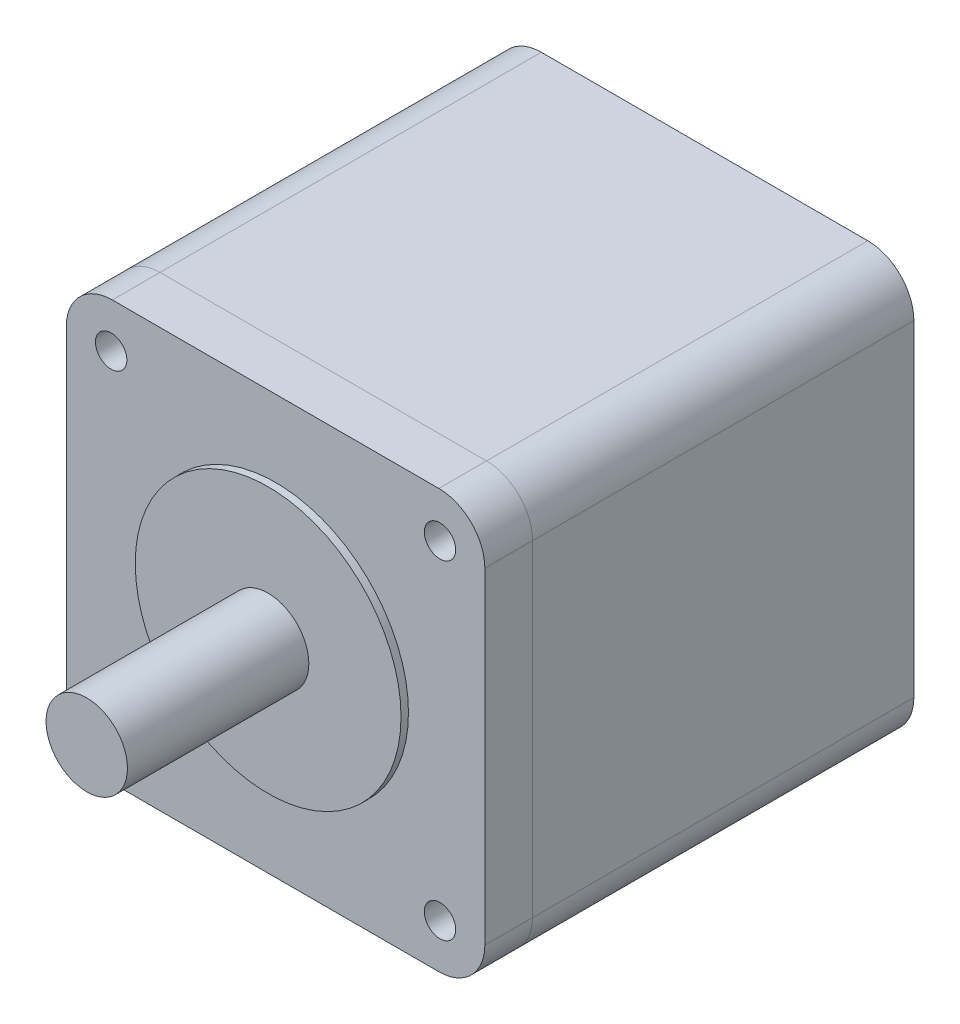
ISO-10303-21;
HEADER;
FILE_DESCRIPTION(('STEP AP214'),'2;1');
FILE_NAME('part.step','',(''),(''),'','','');
FILE_SCHEMA(('AUTOMOTIVE_DESIGN { 1 0 10303 214 1 1 1 1 }'));
ENDSEC;
DATA;
#1=APPLICATION_CONTEXT('core data for automotive mechanical design processes');
#2=APPLICATION_PROTOCOL_DEFINITION('international standard','automotive_design',2000,#1);
#3=PRODUCT_CONTEXT('',#1,'mechanical');
#4=PRODUCT('Part','Part','',(#3));
#5=PRODUCT_RELATED_PRODUCT_CATEGORY('part','',(#4));
#6=PRODUCT_DEFINITION_FORMATION('','',#4);
#7=PRODUCT_DEFINITION_CONTEXT('part definition',#1,'design');
#8=PRODUCT_DEFINITION('design','',#6,#7);
#9=PRODUCT_DEFINITION_SHAPE('','',#8);
#10=(LENGTH_UNIT() NAMED_UNIT(*) SI_UNIT(.MILLI.,.METRE.));
#11=(NAMED_UNIT(*) PLANE_ANGLE_UNIT() SI_UNIT($,.RADIAN.));
#12=(NAMED_UNIT(*) SI_UNIT($,.STERADIAN.) SOLID_ANGLE_UNIT());
#13=UNCERTAINTY_MEASURE_WITH_UNIT(LENGTH_MEASURE(1.E-05),#10,'distance_accuracy_value','');
#14=(GEOMETRIC_REPRESENTATION_CONTEXT(3) GLOBAL_UNCERTAINTY_ASSIGNED_CONTEXT((#13)) GLOBAL_UNIT_ASSIGNED_CONTEXT((#10,
#11,#12)) REPRESENTATION_CONTEXT('',''));
#15=CARTESIAN_POINT('',(0.,0.,0.));
#16=DIRECTION('',(0.,0.,1.));
#17=DIRECTION('',(1.,0.,0.));
#18=AXIS2_PLACEMENT_3D('',#15,#16,#17);
#19=CARTESIAN_POINT('',(70.2060040014881,-70.2060040014881,-164.));
#20=DIRECTION('',(0.,0.,1.));
#21=DIRECTION('',(1.,0.,0.));
#22=AXIS2_PLACEMENT_3D('',#19,#20,#21);
#23=CYLINDRICAL_SURFACE('',#22,19.7939959985119);
#24=CARTESIAN_POINT('',(70.2060040014881,-70.2060040014881,0.));
#25=DIRECTION('',(0.,0.,-1.));
#26=DIRECTION('',(1.,0.,0.));
#27=AXIS2_PLACEMENT_3D('',#24,#25,#26);
#28=CIRCLE('',#27,19.7939959985119);
#29=CARTESIAN_POINT('',(90.,-70.206004001488,0.));
#30=VERTEX_POINT('',#29);
#31=CARTESIAN_POINT('',(70.206004001488,-90.,0.));
#32=VERTEX_POINT('',#31);
#33=EDGE_CURVE('E154',#30,#32,#28,.T.);
#34=ORIENTED_EDGE('',*,*,#33,.T.);
#35=DIRECTION('',(0.,0.,1.));
#36=VECTOR('',#35,1.);
#37=CARTESIAN_POINT('',(70.206004001488,-90.,-164.));
#38=LINE('',#37,#36);
#39=CARTESIAN_POINT('',(70.206004001488,-90.,-164.));
#40=VERTEX_POINT('',#39);
#41=EDGE_CURVE('E12',#40,#32,#38,.T.);
#42=ORIENTED_EDGE('',*,*,#41,.F.);
#43=CARTESIAN_POINT('',(70.2060040014881,-70.2060040014881,-164.));
#44=DIRECTION('',(0.,0.,-1.));
#45=DIRECTION('',(1.,0.,0.));
#46=AXIS2_PLACEMENT_3D('',#43,#44,#45);
#47=CIRCLE('',#46,19.7939959985119);
#48=CARTESIAN_POINT('',(90.,-70.206004001488,-164.));
#49=VERTEX_POINT('',#48);
#50=EDGE_CURVE('E176',#49,#40,#47,.T.);
#51=ORIENTED_EDGE('',*,*,#50,.F.);
#52=DIRECTION('',(0.,0.,1.));
#53=VECTOR('',#52,1.);
#54=CARTESIAN_POINT('',(90.,-70.206004001488,-164.));
#55=LINE('',#54,#53);
#56=EDGE_CURVE('E150',#49,#30,#55,.T.);
#57=ORIENTED_EDGE('',*,*,#56,.T.);
#58=EDGE_LOOP('',(#34,#42,#51,#57));
#59=FACE_BOUND('',#58,.T.);
#60=ADVANCED_FACE('F53',(#59),#23,.T.);
#61=CARTESIAN_POINT('',(70.206004001488,-90.,-164.));
#62=DIRECTION('',(0.,1.,0.));
#63=DIRECTION('',(0.,0.,1.));
#64=AXIS2_PLACEMENT_3D('',#61,#62,#63);
#65=PLANE('',#64);
#66=DIRECTION('',(-1.,0.,0.));
#67=VECTOR('',#66,1.);
#68=CARTESIAN_POINT('',(70.206004001488,-90.,0.));
#69=LINE('',#68,#67);
#70=CARTESIAN_POINT('',(-70.206004001488,-90.,0.));
#71=VERTEX_POINT('',#70);
#72=EDGE_CURVE('E158',#32,#71,#69,.T.);
#73=ORIENTED_EDGE('',*,*,#72,.T.);
#74=DIRECTION('',(0.,0.,1.));
#75=VECTOR('',#74,1.);
#76=CARTESIAN_POINT('',(-70.206004001488,-90.,-164.));
#77=LINE('',#76,#75);
#78=CARTESIAN_POINT('',(-70.206004001488,-90.,-164.));
#79=VERTEX_POINT('',#78);
#80=EDGE_CURVE('E62',#79,#71,#77,.T.);
#81=ORIENTED_EDGE('',*,*,#80,.F.);
#82=DIRECTION('',(-1.,0.,0.));
#83=VECTOR('',#82,1.);
#84=CARTESIAN_POINT('',(70.206004001488,-90.,-164.));
#85=LINE('',#84,#83);
#86=EDGE_CURVE('E113',#40,#79,#85,.T.);
#87=ORIENTED_EDGE('',*,*,#86,.F.);
#88=ORIENTED_EDGE('',*,*,#41,.T.);
#89=EDGE_LOOP('',(#73,#81,#87,#88));
#90=FACE_BOUND('',#89,.T.);
#91=ADVANCED_FACE('F222',(#90),#65,.F.);
#92=CARTESIAN_POINT('',(-70.2060040014881,-70.2060040014881,-164.));
#93=DIRECTION('',(0.,0.,1.));
#94=DIRECTION('',(1.,0.,0.));
#95=AXIS2_PLACEMENT_3D('',#92,#93,#94);
#96=CYLINDRICAL_SURFACE('',#95,19.7939959985119);
#97=CARTESIAN_POINT('',(-70.2060040014881,-70.2060040014881,0.));
#98=DIRECTION('',(0.,0.,-1.));
#99=DIRECTION('',(-1.,0.,0.));
#100=AXIS2_PLACEMENT_3D('',#97,#98,#99);
#101=CIRCLE('',#100,19.7939959985119);
#102=CARTESIAN_POINT('',(-90.,-70.2060040014881,0.));
#103=VERTEX_POINT('',#102);
#104=EDGE_CURVE('E161',#71,#103,#101,.T.);
#105=ORIENTED_EDGE('',*,*,#104,.T.);
#106=DIRECTION('',(0.,0.,1.));
#107=VECTOR('',#106,1.);
#108=CARTESIAN_POINT('',(-90.,-70.2060040014881,-164.));
#109=LINE('',#108,#107);
#110=CARTESIAN_POINT('',(-90.,-70.2060040014881,-164.));
#111=VERTEX_POINT('',#110);
#112=EDGE_CURVE('E187',#111,#103,#109,.T.);
#113=ORIENTED_EDGE('',*,*,#112,.F.);
#114=CARTESIAN_POINT('',(-70.2060040014881,-70.2060040014881,-164.));
#115=DIRECTION('',(0.,0.,-1.));
#116=DIRECTION('',(-1.,0.,0.));
#117=AXIS2_PLACEMENT_3D('',#114,#115,#116);
#118=CIRCLE('',#117,19.7939959985119);
#119=EDGE_CURVE('E197',#79,#111,#118,.T.);
#120=ORIENTED_EDGE('',*,*,#119,.F.);
#121=ORIENTED_EDGE('',*,*,#80,.T.);
#122=EDGE_LOOP('',(#105,#113,#120,#121));
#123=FACE_BOUND('',#122,.T.);
#124=ADVANCED_FACE('F195',(#123),#96,.T.);
#125=CARTESIAN_POINT('',(-90.,-70.206004001488,-164.));
#126=DIRECTION('',(1.,0.,0.));
#127=DIRECTION('',(0.,0.,-1.));
#128=AXIS2_PLACEMENT_3D('',#125,#126,#127);
#129=PLANE('',#128);
#130=DIRECTION('',(0.,1.,0.));
#131=VECTOR('',#130,1.);
#132=CARTESIAN_POINT('',(-90.,-70.206004001488,0.));
#133=LINE('',#132,#131);
#134=CARTESIAN_POINT('',(-90.,70.206004001488,0.));
#135=VERTEX_POINT('',#134);
#136=EDGE_CURVE('E164',#103,#135,#133,.T.);
#137=ORIENTED_EDGE('',*,*,#136,.T.);
#138=DIRECTION('',(0.,0.,1.));
#139=VECTOR('',#138,1.);
#140=CARTESIAN_POINT('',(-90.,70.206004001488,-164.));
#141=LINE('',#140,#139);
#142=CARTESIAN_POINT('',(-90.,70.206004001488,-164.));
#143=VERTEX_POINT('',#142);
#144=EDGE_CURVE('E183',#143,#135,#141,.T.);
#145=ORIENTED_EDGE('',*,*,#144,.F.);
#146=DIRECTION('',(0.,1.,0.));
#147=VECTOR('',#146,1.);
#148=CARTESIAN_POINT('',(-90.,-70.206004001488,-164.));
#149=LINE('',#148,#147);
#150=EDGE_CURVE('E210',#111,#143,#149,.T.);
#151=ORIENTED_EDGE('',*,*,#150,.F.);
#152=ORIENTED_EDGE('',*,*,#112,.T.);
#153=EDGE_LOOP('',(#137,#145,#151,#152));
#154=FACE_BOUND('',#153,.T.);
#155=ADVANCED_FACE('F205',(#154),#129,.F.);
#156=CARTESIAN_POINT('',(-70.2060040014881,70.2060040014881,-164.));
#157=DIRECTION('',(0.,0.,1.));
#158=DIRECTION('',(1.,0.,0.));
#159=AXIS2_PLACEMENT_3D('',#156,#157,#158);
#160=CYLINDRICAL_SURFACE('',#159,19.7939959985119);
#161=CARTESIAN_POINT('',(-70.2060040014881,70.2060040014881,0.));
#162=DIRECTION('',(0.,0.,-1.));
#163=DIRECTION('',(-1.,0.,0.));
#164=AXIS2_PLACEMENT_3D('',#161,#162,#163);
#165=CIRCLE('',#164,19.7939959985119);
#166=CARTESIAN_POINT('',(-70.206004001488,90.,0.));
#167=VERTEX_POINT('',#166);
#168=EDGE_CURVE('E167',#135,#167,#165,.T.);
#169=ORIENTED_EDGE('',*,*,#168,.T.);
#170=DIRECTION('',(0.,0.,1.));
#171=VECTOR('',#170,1.);
#172=CARTESIAN_POINT('',(-70.206004001488,90.,-164.));
#173=LINE('',#172,#171);
#174=CARTESIAN_POINT('',(-70.206004001488,90.,-164.));
#175=VERTEX_POINT('',#174);
#176=EDGE_CURVE('E143',#175,#167,#173,.T.);
#177=ORIENTED_EDGE('',*,*,#176,.F.);
#178=CARTESIAN_POINT('',(-70.2060040014881,70.2060040014881,-164.));
#179=DIRECTION('',(0.,0.,-1.));
#180=DIRECTION('',(-1.,0.,0.));
#181=AXIS2_PLACEMENT_3D('',#178,#179,#180);
#182=CIRCLE('',#181,19.7939959985119);
#183=EDGE_CURVE('E132',#143,#175,#182,.T.);
#184=ORIENTED_EDGE('',*,*,#183,.F.);
#185=ORIENTED_EDGE('',*,*,#144,.T.);
#186=EDGE_LOOP('',(#169,#177,#184,#185));
#187=FACE_BOUND('',#186,.T.);
#188=ADVANCED_FACE('F208',(#187),#160,.T.);
#189=CARTESIAN_POINT('',(70.206004001488,90.,-164.));
#190=DIRECTION('',(0.,-1.,0.));
#191=DIRECTION('',(0.,0.,-1.));
#192=AXIS2_PLACEMENT_3D('',#189,#190,#191);
#193=PLANE('',#192);
#194=DIRECTION('',(1.,0.,0.));
#195=VECTOR('',#194,1.);
#196=CARTESIAN_POINT('',(70.206004001488,90.,0.));
#197=LINE('',#196,#195);
#198=CARTESIAN_POINT('',(70.206004001488,90.,0.));
#199=VERTEX_POINT('',#198);
#200=EDGE_CURVE('E141',#167,#199,#197,.T.);
#201=ORIENTED_EDGE('',*,*,#200,.T.);
#202=DIRECTION('',(0.,0.,1.));
#203=VECTOR('',#202,1.);
#204=CARTESIAN_POINT('',(70.206004001488,90.,-164.));
#205=LINE('',#204,#203);
#206=CARTESIAN_POINT('',(70.206004001488,90.,-164.));
#207=VERTEX_POINT('',#206);
#208=EDGE_CURVE('E138',#207,#199,#205,.T.);
#209=ORIENTED_EDGE('',*,*,#208,.F.);
#210=DIRECTION('',(1.,0.,0.));
#211=VECTOR('',#210,1.);
#212=CARTESIAN_POINT('',(70.206004001488,90.,-164.));
#213=LINE('',#212,#211);
#214=EDGE_CURVE('E126',#175,#207,#213,.T.);
#215=ORIENTED_EDGE('',*,*,#214,.F.);
#216=ORIENTED_EDGE('',*,*,#176,.T.);
#217=EDGE_LOOP('',(#201,#209,#215,#216));
#218=FACE_BOUND('',#217,.T.);
#219=ADVANCED_FACE('F139',(#218),#193,.F.);
#220=CARTESIAN_POINT('',(70.2060040014881,70.2060040014881,-164.));
#221=DIRECTION('',(0.,0.,1.));
#222=DIRECTION('',(1.,0.,0.));
#223=AXIS2_PLACEMENT_3D('',#220,#221,#222);
#224=CYLINDRICAL_SURFACE('',#223,19.7939959985119);
#225=CARTESIAN_POINT('',(70.2060040014881,70.2060040014881,0.));
#226=DIRECTION('',(0.,0.,-1.));
#227=DIRECTION('',(-1.,0.,0.));
#228=AXIS2_PLACEMENT_3D('',#225,#226,#227);
#229=CIRCLE('',#228,19.7939959985119);
#230=CARTESIAN_POINT('',(90.,70.206004001488,0.));
#231=VERTEX_POINT('',#230);
#232=EDGE_CURVE('E99',#199,#231,#229,.T.);
#233=ORIENTED_EDGE('',*,*,#232,.T.);
#234=DIRECTION('',(0.,0.,1.));
#235=VECTOR('',#234,1.);
#236=CARTESIAN_POINT('',(90.,70.206004001488,-164.));
#237=LINE('',#236,#235);
#238=CARTESIAN_POINT('',(90.,70.206004001488,-164.));
#239=VERTEX_POINT('',#238);
#240=EDGE_CURVE('E144',#239,#231,#237,.T.);
#241=ORIENTED_EDGE('',*,*,#240,.F.);
#242=CARTESIAN_POINT('',(70.2060040014881,70.2060040014881,-164.));
#243=DIRECTION('',(0.,0.,-1.));
#244=DIRECTION('',(-1.,0.,0.));
#245=AXIS2_PLACEMENT_3D('',#242,#243,#244);
#246=CIRCLE('',#245,19.7939959985119);
#247=EDGE_CURVE('E130',#207,#239,#246,.T.);
#248=ORIENTED_EDGE('',*,*,#247,.F.);
#249=ORIENTED_EDGE('',*,*,#208,.T.);
#250=EDGE_LOOP('',(#233,#241,#248,#249));
#251=FACE_BOUND('',#250,.T.);
#252=ADVANCED_FACE('F146',(#251),#224,.T.);
#253=CARTESIAN_POINT('',(90.,-70.206004001488,-164.));
#254=DIRECTION('',(-1.,0.,0.));
#255=DIRECTION('',(0.,0.,1.));
#256=AXIS2_PLACEMENT_3D('',#253,#254,#255);
#257=PLANE('',#256);
#258=DIRECTION('',(0.,-1.,0.));
#259=VECTOR('',#258,1.);
#260=CARTESIAN_POINT('',(90.,-70.206004001488,0.));
#261=LINE('',#260,#259);
#262=EDGE_CURVE('E105',#231,#30,#261,.T.);
#263=ORIENTED_EDGE('',*,*,#262,.T.);
#264=ORIENTED_EDGE('',*,*,#56,.F.);
#265=DIRECTION('',(0.,-1.,0.));
#266=VECTOR('',#265,1.);
#267=CARTESIAN_POINT('',(90.,-70.206004001488,-164.));
#268=LINE('',#267,#266);
#269=EDGE_CURVE('E70',#239,#49,#268,.T.);
#270=ORIENTED_EDGE('',*,*,#269,.F.);
#271=ORIENTED_EDGE('',*,*,#240,.T.);
#272=EDGE_LOOP('',(#263,#264,#270,#271));
#273=FACE_BOUND('',#272,.T.);
#274=ADVANCED_FACE('F238',(#273),#257,.F.);
#275=CARTESIAN_POINT('',(70.2060040014881,-70.2060040014881,-164.));
#276=DIRECTION('',(0.,0.,1.));
#277=DIRECTION('',(1.,0.,0.));
#278=AXIS2_PLACEMENT_3D('',#275,#276,#277);
#279=PLANE('',#278);
#280=ORIENTED_EDGE('',*,*,#50,.T.);
#281=ORIENTED_EDGE('',*,*,#86,.T.);
#282=ORIENTED_EDGE('',*,*,#119,.T.);
#283=ORIENTED_EDGE('',*,*,#150,.T.);
#284=ORIENTED_EDGE('',*,*,#183,.T.);
#285=ORIENTED_EDGE('',*,*,#214,.T.);
#286=ORIENTED_EDGE('',*,*,#247,.T.);
#287=ORIENTED_EDGE('',*,*,#269,.T.);
#288=EDGE_LOOP('',(#280,#281,#282,#283,#284,#285,#286,#287));
#289=FACE_BOUND('',#288,.T.);
#290=ADVANCED_FACE('F128',(#289),#279,.F.);
#291=CARTESIAN_POINT('',(70.2060040014881,-70.2060040014881,0.));
#292=DIRECTION('',(0.,0.,1.));
#293=DIRECTION('',(1.,0.,0.));
#294=AXIS2_PLACEMENT_3D('',#291,#292,#293);
#295=PLANE('',#294);
#296=ORIENTED_EDGE('',*,*,#33,.F.);
#297=ORIENTED_EDGE('',*,*,#262,.F.);
#298=ORIENTED_EDGE('',*,*,#232,.F.);
#299=ORIENTED_EDGE('',*,*,#200,.F.);
#300=ORIENTED_EDGE('',*,*,#168,.F.);
#301=ORIENTED_EDGE('',*,*,#136,.F.);
#302=ORIENTED_EDGE('',*,*,#104,.F.);
#303=ORIENTED_EDGE('',*,*,#72,.F.);
#304=EDGE_LOOP('',(#296,#297,#298,#299,#300,#301,#302,#303));
#305=FACE_BOUND('',#304,.T.);
#306=ADVANCED_FACE('F201',(#305),#295,.T.);
#307=CLOSED_SHELL('',(#60,#91,#124,#155,#188,#219,#252,#274,#290,#306));
#308=MANIFOLD_SOLID_BREP('B2',#307);
#309=CARTESIAN_POINT('',(-70.2060040014881,-70.2060040014881,20.5));
#310=DIRECTION('',(0.,0.,-1.));
#311=DIRECTION('',(-1.,0.,0.));
#312=AXIS2_PLACEMENT_3D('',#309,#310,#311);
#313=CYLINDRICAL_SURFACE('',#312,19.7939959985119);
#314=CARTESIAN_POINT('',(-70.2060040014881,-70.2060040014881,0.));
#315=DIRECTION('',(0.,0.,1.));
#316=DIRECTION('',(-1.,0.,0.));
#317=AXIS2_PLACEMENT_3D('',#314,#315,#316);
#318=CIRCLE('',#317,19.7939959985119);
#319=CARTESIAN_POINT('',(-90.,-70.206004001488,0.));
#320=VERTEX_POINT('',#319);
#321=CARTESIAN_POINT('',(-70.206004001488,-90.,0.));
#322=VERTEX_POINT('',#321);
#323=EDGE_CURVE('E423',#320,#322,#318,.T.);
#324=ORIENTED_EDGE('',*,*,#323,.T.);
#325=DIRECTION('',(0.,0.,-1.));
#326=VECTOR('',#325,1.);
#327=CARTESIAN_POINT('',(-70.206004001488,-90.,20.5));
#328=LINE('',#327,#326);
#329=CARTESIAN_POINT('',(-70.206004001488,-90.,20.5));
#330=VERTEX_POINT('',#329);
#331=EDGE_CURVE('E450',#330,#322,#328,.T.);
#332=ORIENTED_EDGE('',*,*,#331,.F.);
#333=CARTESIAN_POINT('',(-70.2060040014881,-70.2060040014881,20.5));
#334=DIRECTION('',(0.,0.,1.));
#335=DIRECTION('',(-1.,0.,0.));
#336=AXIS2_PLACEMENT_3D('',#333,#334,#335);
#337=CIRCLE('',#336,19.7939959985119);
#338=CARTESIAN_POINT('',(-90.,-70.206004001488,20.5));
#339=VERTEX_POINT('',#338);
#340=EDGE_CURVE('E438',#339,#330,#337,.T.);
#341=ORIENTED_EDGE('',*,*,#340,.F.);
#342=DIRECTION('',(0.,0.,-1.));
#343=VECTOR('',#342,1.);
#344=CARTESIAN_POINT('',(-90.,-70.206004001488,20.5));
#345=LINE('',#344,#343);
#346=EDGE_CURVE('E419',#339,#320,#345,.T.);
#347=ORIENTED_EDGE('',*,*,#346,.T.);
#348=EDGE_LOOP('',(#324,#332,#341,#347));
#349=FACE_BOUND('',#348,.T.);
#350=ADVANCED_FACE('F325',(#349),#313,.T.);
#351=CARTESIAN_POINT('',(-70.206004001488,-90.,20.5));
#352=DIRECTION('',(0.,1.,0.));
#353=DIRECTION('',(0.,0.,1.));
#354=AXIS2_PLACEMENT_3D('',#351,#352,#353);
#355=PLANE('',#354);
#356=DIRECTION('',(1.,0.,0.));
#357=VECTOR('',#356,1.);
#358=CARTESIAN_POINT('',(-70.206004001488,-90.,0.));
#359=LINE('',#358,#357);
#360=CARTESIAN_POINT('',(70.206004001488,-90.,0.));
#361=VERTEX_POINT('',#360);
#362=EDGE_CURVE('E426',#322,#361,#359,.T.);
#363=ORIENTED_EDGE('',*,*,#362,.T.);
#364=DIRECTION('',(0.,0.,-1.));
#365=VECTOR('',#364,1.);
#366=CARTESIAN_POINT('',(70.206004001488,-90.,20.5));
#367=LINE('',#366,#365);
#368=CARTESIAN_POINT('',(70.206004001488,-90.,20.5));
#369=VERTEX_POINT('',#368);
#370=EDGE_CURVE('E448',#369,#361,#367,.T.);
#371=ORIENTED_EDGE('',*,*,#370,.F.);
#372=DIRECTION('',(1.,0.,0.));
#373=VECTOR('',#372,1.);
#374=CARTESIAN_POINT('',(-70.206004001488,-90.,20.5));
#375=LINE('',#374,#373);
#376=EDGE_CURVE('E386',#330,#369,#375,.T.);
#377=ORIENTED_EDGE('',*,*,#376,.F.);
#378=ORIENTED_EDGE('',*,*,#331,.T.);
#379=EDGE_LOOP('',(#363,#371,#377,#378));
#380=FACE_BOUND('',#379,.T.);
#381=ADVANCED_FACE('F513',(#380),#355,.F.);
#382=CARTESIAN_POINT('',(70.2060040014881,-70.2060040014881,20.5));
#383=DIRECTION('',(0.,0.,-1.));
#384=DIRECTION('',(-1.,0.,0.));
#385=AXIS2_PLACEMENT_3D('',#382,#383,#384);
#386=CYLINDRICAL_SURFACE('',#385,19.7939959985119);
#387=CARTESIAN_POINT('',(70.2060040014881,-70.2060040014881,0.));
#388=DIRECTION('',(0.,0.,1.));
#389=DIRECTION('',(1.,0.,0.));
#390=AXIS2_PLACEMENT_3D('',#387,#388,#389);
#391=CIRCLE('',#390,19.7939959985119);
#392=CARTESIAN_POINT('',(90.,-70.2060040014881,0.));
#393=VERTEX_POINT('',#392);
#394=EDGE_CURVE('E429',#361,#393,#391,.T.);
#395=ORIENTED_EDGE('',*,*,#394,.T.);
#396=DIRECTION('',(0.,0.,-1.));
#397=VECTOR('',#396,1.);
#398=CARTESIAN_POINT('',(90.,-70.2060040014881,20.5));
#399=LINE('',#398,#397);
#400=CARTESIAN_POINT('',(90.,-70.2060040014881,20.5));
#401=VERTEX_POINT('',#400);
#402=EDGE_CURVE('E445',#401,#393,#399,.T.);
#403=ORIENTED_EDGE('',*,*,#402,.F.);
#404=CARTESIAN_POINT('',(70.2060040014881,-70.2060040014881,20.5));
#405=DIRECTION('',(0.,0.,1.));
#406=DIRECTION('',(1.,0.,0.));
#407=AXIS2_PLACEMENT_3D('',#404,#405,#406);
#408=CIRCLE('',#407,19.7939959985119);
#409=EDGE_CURVE('E487',#369,#401,#408,.T.);
#410=ORIENTED_EDGE('',*,*,#409,.F.);
#411=ORIENTED_EDGE('',*,*,#370,.T.);
#412=EDGE_LOOP('',(#395,#403,#410,#411));
#413=FACE_BOUND('',#412,.T.);
#414=ADVANCED_FACE('F517',(#413),#386,.T.);
#415=CARTESIAN_POINT('',(90.,-70.206004001488,20.5));
#416=DIRECTION('',(-1.,0.,0.));
#417=DIRECTION('',(0.,0.,1.));
#418=AXIS2_PLACEMENT_3D('',#415,#416,#417);
#419=PLANE('',#418);
#420=DIRECTION('',(0.,1.,0.));
#421=VECTOR('',#420,1.);
#422=CARTESIAN_POINT('',(90.,-70.206004001488,0.));
#423=LINE('',#422,#421);
#424=CARTESIAN_POINT('',(90.,70.206004001488,0.));
#425=VERTEX_POINT('',#424);
#426=EDGE_CURVE('E431',#393,#425,#423,.T.);
#427=ORIENTED_EDGE('',*,*,#426,.T.);
#428=DIRECTION('',(0.,0.,-1.));
#429=VECTOR('',#428,1.);
#430=CARTESIAN_POINT('',(90.,70.206004001488,20.5));
#431=LINE('',#430,#429);
#432=CARTESIAN_POINT('',(90.,70.206004001488,20.5));
#433=VERTEX_POINT('',#432);
#434=EDGE_CURVE('E442',#433,#425,#431,.T.);
#435=ORIENTED_EDGE('',*,*,#434,.F.);
#436=DIRECTION('',(0.,1.,0.));
#437=VECTOR('',#436,1.);
#438=CARTESIAN_POINT('',(90.,-70.206004001488,20.5));
#439=LINE('',#438,#437);
#440=EDGE_CURVE('E489',#401,#433,#439,.T.);
#441=ORIENTED_EDGE('',*,*,#440,.F.);
#442=ORIENTED_EDGE('',*,*,#402,.T.);
#443=EDGE_LOOP('',(#427,#435,#441,#442));
#444=FACE_BOUND('',#443,.T.);
#445=ADVANCED_FACE('F495',(#444),#419,.F.);
#446=CARTESIAN_POINT('',(70.2060040014881,70.2060040014881,20.5));
#447=DIRECTION('',(0.,0.,-1.));
#448=DIRECTION('',(-1.,0.,0.));
#449=AXIS2_PLACEMENT_3D('',#446,#447,#448);
#450=CYLINDRICAL_SURFACE('',#449,19.7939959985119);
#451=CARTESIAN_POINT('',(70.2060040014881,70.2060040014881,0.));
#452=DIRECTION('',(0.,0.,1.));
#453=DIRECTION('',(1.,0.,0.));
#454=AXIS2_PLACEMENT_3D('',#451,#452,#453);
#455=CIRCLE('',#454,19.7939959985119);
#456=CARTESIAN_POINT('',(70.206004001488,90.,0.));
#457=VERTEX_POINT('',#456);
#458=EDGE_CURVE('E433',#425,#457,#455,.T.);
#459=ORIENTED_EDGE('',*,*,#458,.T.);
#460=DIRECTION('',(0.,0.,-1.));
#461=VECTOR('',#460,1.);
#462=CARTESIAN_POINT('',(70.206004001488,90.,20.5));
#463=LINE('',#462,#461);
#464=CARTESIAN_POINT('',(70.206004001488,90.,20.5));
#465=VERTEX_POINT('',#464);
#466=EDGE_CURVE('E414',#465,#457,#463,.T.);
#467=ORIENTED_EDGE('',*,*,#466,.F.);
#468=CARTESIAN_POINT('',(70.2060040014881,70.2060040014881,20.5));
#469=DIRECTION('',(0.,0.,1.));
#470=DIRECTION('',(1.,0.,0.));
#471=AXIS2_PLACEMENT_3D('',#468,#469,#470);
#472=CIRCLE('',#471,19.7939959985119);
#473=EDGE_CURVE('E405',#433,#465,#472,.T.);
#474=ORIENTED_EDGE('',*,*,#473,.F.);
#475=ORIENTED_EDGE('',*,*,#434,.T.);
#476=EDGE_LOOP('',(#459,#467,#474,#475));
#477=FACE_BOUND('',#476,.T.);
#478=ADVANCED_FACE('F499',(#477),#450,.T.);
#479=CARTESIAN_POINT('',(-70.206004001488,90.,20.5));
#480=DIRECTION('',(0.,-1.,0.));
#481=DIRECTION('',(0.,0.,-1.));
#482=AXIS2_PLACEMENT_3D('',#479,#480,#481);
#483=PLANE('',#482);
#484=DIRECTION('',(-1.,0.,0.));
#485=VECTOR('',#484,1.);
#486=CARTESIAN_POINT('',(-70.206004001488,90.,0.));
#487=LINE('',#486,#485);
#488=CARTESIAN_POINT('',(-70.206004001488,90.,0.));
#489=VERTEX_POINT('',#488);
#490=EDGE_CURVE('E413',#457,#489,#487,.T.);
#491=ORIENTED_EDGE('',*,*,#490,.T.);
#492=DIRECTION('',(0.,0.,-1.));
#493=VECTOR('',#492,1.);
#494=CARTESIAN_POINT('',(-70.206004001488,90.,20.5));
#495=LINE('',#494,#493);
#496=CARTESIAN_POINT('',(-70.206004001488,90.,20.5));
#497=VERTEX_POINT('',#496);
#498=EDGE_CURVE('E410',#497,#489,#495,.T.);
#499=ORIENTED_EDGE('',*,*,#498,.F.);
#500=DIRECTION('',(-1.,0.,0.));
#501=VECTOR('',#500,1.);
#502=CARTESIAN_POINT('',(-70.206004001488,90.,20.5));
#503=LINE('',#502,#501);
#504=EDGE_CURVE('E399',#465,#497,#503,.T.);
#505=ORIENTED_EDGE('',*,*,#504,.F.);
#506=ORIENTED_EDGE('',*,*,#466,.T.);
#507=EDGE_LOOP('',(#491,#499,#505,#506));
#508=FACE_BOUND('',#507,.T.);
#509=ADVANCED_FACE('F411',(#508),#483,.F.);
#510=CARTESIAN_POINT('',(-70.2060040014881,70.2060040014881,20.5));
#511=DIRECTION('',(0.,0.,-1.));
#512=DIRECTION('',(-1.,0.,0.));
#513=AXIS2_PLACEMENT_3D('',#510,#511,#512);
#514=CYLINDRICAL_SURFACE('',#513,19.7939959985119);
#515=CARTESIAN_POINT('',(-70.2060040014881,70.2060040014881,0.));
#516=DIRECTION('',(0.,0.,1.));
#517=DIRECTION('',(1.,0.,0.));
#518=AXIS2_PLACEMENT_3D('',#515,#516,#517);
#519=CIRCLE('',#518,19.7939959985119);
#520=CARTESIAN_POINT('',(-90.,70.206004001488,0.));
#521=VERTEX_POINT('',#520);
#522=EDGE_CURVE('E371',#489,#521,#519,.T.);
#523=ORIENTED_EDGE('',*,*,#522,.T.);
#524=DIRECTION('',(0.,0.,-1.));
#525=VECTOR('',#524,1.);
#526=CARTESIAN_POINT('',(-90.,70.206004001488,20.5));
#527=LINE('',#526,#525);
#528=CARTESIAN_POINT('',(-90.,70.206004001488,20.5));
#529=VERTEX_POINT('',#528);
#530=EDGE_CURVE('E415',#529,#521,#527,.T.);
#531=ORIENTED_EDGE('',*,*,#530,.F.);
#532=CARTESIAN_POINT('',(-70.2060040014881,70.2060040014881,20.5));
#533=DIRECTION('',(0.,0.,1.));
#534=DIRECTION('',(1.,0.,0.));
#535=AXIS2_PLACEMENT_3D('',#532,#533,#534);
#536=CIRCLE('',#535,19.7939959985119);
#537=EDGE_CURVE('E403',#497,#529,#536,.T.);
#538=ORIENTED_EDGE('',*,*,#537,.F.);
#539=ORIENTED_EDGE('',*,*,#498,.T.);
#540=EDGE_LOOP('',(#523,#531,#538,#539));
#541=FACE_BOUND('',#540,.T.);
#542=ADVANCED_FACE('F417',(#541),#514,.T.);
#543=CARTESIAN_POINT('',(-90.,-70.206004001488,20.5));
#544=DIRECTION('',(1.,0.,0.));
#545=DIRECTION('',(0.,0.,-1.));
#546=AXIS2_PLACEMENT_3D('',#543,#544,#545);
#547=PLANE('',#546);
#548=DIRECTION('',(0.,-1.,0.));
#549=VECTOR('',#548,1.);
#550=CARTESIAN_POINT('',(-90.,-70.206004001488,0.));
#551=LINE('',#550,#549);
#552=EDGE_CURVE('E377',#521,#320,#551,.T.);
#553=ORIENTED_EDGE('',*,*,#552,.T.);
#554=ORIENTED_EDGE('',*,*,#346,.F.);
#555=DIRECTION('',(0.,-1.,0.));
#556=VECTOR('',#555,1.);
#557=CARTESIAN_POINT('',(-90.,-70.206004001488,20.5));
#558=LINE('',#557,#556);
#559=EDGE_CURVE('E342',#529,#339,#558,.T.);
#560=ORIENTED_EDGE('',*,*,#559,.F.);
#561=ORIENTED_EDGE('',*,*,#530,.T.);
#562=EDGE_LOOP('',(#553,#554,#560,#561));
#563=FACE_BOUND('',#562,.T.);
#564=ADVANCED_FACE('F460',(#563),#547,.F.);
#565=CARTESIAN_POINT('',(-70.2060040014881,-70.2060040014881,20.5));
#566=DIRECTION('',(0.,0.,-1.));
#567=DIRECTION('',(-1.,0.,0.));
#568=AXIS2_PLACEMENT_3D('',#565,#566,#567);
#569=PLANE('',#568);
#570=CARTESIAN_POINT('',(0.,0.,20.5));
#571=DIRECTION('',(0.,0.,-1.));
#572=DIRECTION('',(-1.,0.,0.));
#573=AXIS2_PLACEMENT_3D('',#570,#571,#572);
#574=CIRCLE('',#573,57.15);
#575=CARTESIAN_POINT('',(-57.15,0.,20.5));
#576=VERTEX_POINT('',#575);
#577=EDGE_CURVE('E328',#576,#576,#574,.F.);
#578=ORIENTED_EDGE('',*,*,#577,.F.);
#579=EDGE_LOOP('',(#578));
#580=FACE_BOUND('',#579,.T.);
#581=CARTESIAN_POINT('',(-70.7107000000007,-70.7106999999993,20.5));
#582=DIRECTION('',(0.,0.,1.));
#583=DIRECTION('',(1.,0.,0.));
#584=AXIS2_PLACEMENT_3D('',#581,#582,#583);
#585=CIRCLE('',#584,6.75000000000001);
#586=CARTESIAN_POINT('',(-63.9607000000007,-70.7106999999993,20.5));
#587=VERTEX_POINT('',#586);
#588=EDGE_CURVE('E465',#587,#587,#585,.T.);
#589=ORIENTED_EDGE('',*,*,#588,.F.);
#590=EDGE_LOOP('',(#589));
#591=FACE_BOUND('',#590,.T.);
#592=CARTESIAN_POINT('',(70.7106999999995,-70.7107000000005,20.5));
#593=DIRECTION('',(0.,0.,1.));
#594=DIRECTION('',(1.,0.,0.));
#595=AXIS2_PLACEMENT_3D('',#592,#593,#594);
#596=CIRCLE('',#595,6.75);
#597=CARTESIAN_POINT('',(77.4606999999995,-70.7107000000005,20.5));
#598=VERTEX_POINT('',#597);
#599=EDGE_CURVE('E469',#598,#598,#596,.T.);
#600=ORIENTED_EDGE('',*,*,#599,.F.);
#601=EDGE_LOOP('',(#600));
#602=FACE_BOUND('',#601,.T.);
#603=CARTESIAN_POINT('',(70.7107000000002,70.7106999999997,20.5));
#604=DIRECTION('',(0.,0.,1.));
#605=DIRECTION('',(1.,0.,0.));
#606=AXIS2_PLACEMENT_3D('',#603,#604,#605);
#607=CIRCLE('',#606,6.74999999999999);
#608=CARTESIAN_POINT('',(77.4607000000002,70.7106999999997,20.5));
#609=VERTEX_POINT('',#608);
#610=EDGE_CURVE('E473',#609,#609,#607,.T.);
#611=ORIENTED_EDGE('',*,*,#610,.F.);
#612=EDGE_LOOP('',(#611));
#613=FACE_BOUND('',#612,.T.);
#614=CARTESIAN_POINT('',(-70.7107,70.7107,20.5));
#615=DIRECTION('',(0.,0.,1.));
#616=DIRECTION('',(1.,0.,0.));
#617=AXIS2_PLACEMENT_3D('',#614,#615,#616);
#618=CIRCLE('',#617,6.75);
#619=CARTESIAN_POINT('',(-63.9607,70.7107,20.5));
#620=VERTEX_POINT('',#619);
#621=EDGE_CURVE('E427',#620,#620,#618,.T.);
#622=ORIENTED_EDGE('',*,*,#621,.F.);
#623=EDGE_LOOP('',(#622));
#624=FACE_BOUND('',#623,.T.);
#625=ORIENTED_EDGE('',*,*,#340,.T.);
#626=ORIENTED_EDGE('',*,*,#376,.T.);
#627=ORIENTED_EDGE('',*,*,#409,.T.);
#628=ORIENTED_EDGE('',*,*,#440,.T.);
#629=ORIENTED_EDGE('',*,*,#473,.T.);
#630=ORIENTED_EDGE('',*,*,#504,.T.);
#631=ORIENTED_EDGE('',*,*,#537,.T.);
#632=ORIENTED_EDGE('',*,*,#559,.T.);
#633=EDGE_LOOP('',(#625,#626,#627,#628,#629,#630,#631,#632));
#634=FACE_BOUND('',#633,.T.);
#635=ADVANCED_FACE('F401',(#580,#591,#602,#613,#624,#634),#569,.F.);
#636=CARTESIAN_POINT('',(-70.2060040014881,-70.2060040014881,0.));
#637=DIRECTION('',(0.,0.,-1.));
#638=DIRECTION('',(-1.,0.,0.));
#639=AXIS2_PLACEMENT_3D('',#636,#637,#638);
#640=PLANE('',#639);
#641=CARTESIAN_POINT('',(-70.7107000000007,-70.7106999999993,0.));
#642=DIRECTION('',(0.,0.,-1.));
#643=DIRECTION('',(-1.,0.,0.));
#644=AXIS2_PLACEMENT_3D('',#641,#642,#643);
#645=CIRCLE('',#644,6.75000000000001);
#646=CARTESIAN_POINT('',(-77.4607000000007,-70.7106999999993,0.));
#647=VERTEX_POINT('',#646);
#648=EDGE_CURVE('E714',#647,#647,#645,.F.);
#649=ORIENTED_EDGE('',*,*,#648,.T.);
#650=EDGE_LOOP('',(#649));
#651=FACE_BOUND('',#650,.T.);
#652=CARTESIAN_POINT('',(70.7106999999995,-70.7107000000005,0.));
#653=DIRECTION('',(0.,0.,-1.));
#654=DIRECTION('',(-1.,0.,0.));
#655=AXIS2_PLACEMENT_3D('',#652,#653,#654);
#656=CIRCLE('',#655,6.75);
#657=CARTESIAN_POINT('',(63.9606999999995,-70.7107000000005,0.));
#658=VERTEX_POINT('',#657);
#659=EDGE_CURVE('E711',#658,#658,#656,.F.);
#660=ORIENTED_EDGE('',*,*,#659,.T.);
#661=EDGE_LOOP('',(#660));
#662=FACE_BOUND('',#661,.T.);
#663=CARTESIAN_POINT('',(70.7107000000002,70.7106999999997,0.));
#664=DIRECTION('',(0.,0.,-1.));
#665=DIRECTION('',(-1.,0.,0.));
#666=AXIS2_PLACEMENT_3D('',#663,#664,#665);
#667=CIRCLE('',#666,6.74999999999999);
#668=CARTESIAN_POINT('',(63.9607000000002,70.7106999999997,0.));
#669=VERTEX_POINT('',#668);
#670=EDGE_CURVE('E480',#669,#669,#667,.F.);
#671=ORIENTED_EDGE('',*,*,#670,.T.);
#672=EDGE_LOOP('',(#671));
#673=FACE_BOUND('',#672,.T.);
#674=CARTESIAN_POINT('',(-70.7107,70.7107,0.));
#675=DIRECTION('',(0.,0.,-1.));
#676=DIRECTION('',(-1.,0.,0.));
#677=AXIS2_PLACEMENT_3D('',#674,#675,#676);
#678=CIRCLE('',#677,6.75);
#679=CARTESIAN_POINT('',(-77.4607,70.7107,0.));
#680=VERTEX_POINT('',#679);
#681=EDGE_CURVE('E477',#680,#680,#678,.F.);
#682=ORIENTED_EDGE('',*,*,#681,.T.);
#683=EDGE_LOOP('',(#682));
#684=FACE_BOUND('',#683,.T.);
#685=ORIENTED_EDGE('',*,*,#323,.F.);
#686=ORIENTED_EDGE('',*,*,#552,.F.);
#687=ORIENTED_EDGE('',*,*,#522,.F.);
#688=ORIENTED_EDGE('',*,*,#490,.F.);
#689=ORIENTED_EDGE('',*,*,#458,.F.);
#690=ORIENTED_EDGE('',*,*,#426,.F.);
#691=ORIENTED_EDGE('',*,*,#394,.F.);
#692=ORIENTED_EDGE('',*,*,#362,.F.);
#693=EDGE_LOOP('',(#685,#686,#687,#688,#689,#690,#691,#692));
#694=FACE_BOUND('',#693,.T.);
#695=ADVANCED_FACE('F459',(#651,#662,#673,#684,#694),#640,.T.);
#696=CARTESIAN_POINT('',(-70.7107,70.7107,-0.001000000000001));
#697=DIRECTION('',(0.,0.,1.));
#698=DIRECTION('',(1.,0.,0.));
#699=AXIS2_PLACEMENT_3D('',#696,#697,#698);
#700=CYLINDRICAL_SURFACE('',#699,6.75);
#701=ORIENTED_EDGE('',*,*,#681,.F.);
#702=EDGE_LOOP('',(#701));
#703=FACE_BOUND('',#702,.T.);
#704=ORIENTED_EDGE('',*,*,#621,.T.);
#705=EDGE_LOOP('',(#704));
#706=FACE_BOUND('',#705,.T.);
#707=ADVANCED_FACE('F553',(#703,#706),#700,.F.);
#708=CARTESIAN_POINT('',(70.7107000000002,70.7106999999997,-0.001000000000001));
#709=DIRECTION('',(0.,0.,1.));
#710=DIRECTION('',(1.,0.,0.));
#711=AXIS2_PLACEMENT_3D('',#708,#709,#710);
#712=CYLINDRICAL_SURFACE('',#711,6.74999999999999);
#713=ORIENTED_EDGE('',*,*,#670,.F.);
#714=EDGE_LOOP('',(#713));
#715=FACE_BOUND('',#714,.T.);
#716=ORIENTED_EDGE('',*,*,#610,.T.);
#717=EDGE_LOOP('',(#716));
#718=FACE_BOUND('',#717,.T.);
#719=ADVANCED_FACE('F563',(#715,#718),#712,.F.);
#720=CARTESIAN_POINT('',(70.7106999999995,-70.7107000000005,-0.001000000000001));
#721=DIRECTION('',(0.,0.,1.));
#722=DIRECTION('',(1.,0.,0.));
#723=AXIS2_PLACEMENT_3D('',#720,#721,#722);
#724=CYLINDRICAL_SURFACE('',#723,6.75);
#725=ORIENTED_EDGE('',*,*,#659,.F.);
#726=EDGE_LOOP('',(#725));
#727=FACE_BOUND('',#726,.T.);
#728=ORIENTED_EDGE('',*,*,#599,.T.);
#729=EDGE_LOOP('',(#728));
#730=FACE_BOUND('',#729,.T.);
#731=ADVANCED_FACE('F574',(#727,#730),#724,.F.);
#732=CARTESIAN_POINT('',(-70.7107000000007,-70.7106999999993,-0.001000000000001));
#733=DIRECTION('',(0.,0.,1.));
#734=DIRECTION('',(1.,0.,0.));
#735=AXIS2_PLACEMENT_3D('',#732,#733,#734);
#736=CYLINDRICAL_SURFACE('',#735,6.75000000000001);
#737=ORIENTED_EDGE('',*,*,#648,.F.);
#738=EDGE_LOOP('',(#737));
#739=FACE_BOUND('',#738,.T.);
#740=ORIENTED_EDGE('',*,*,#588,.T.);
#741=EDGE_LOOP('',(#740));
#742=FACE_BOUND('',#741,.T.);
#743=ADVANCED_FACE('F585',(#739,#742),#736,.F.);
#744=CARTESIAN_POINT('',(0.,0.,23.7));
#745=DIRECTION('',(0.,0.,-1.));
#746=DIRECTION('',(-1.,0.,0.));
#747=AXIS2_PLACEMENT_3D('',#744,#745,#746);
#748=CYLINDRICAL_SURFACE('',#747,57.15);
#749=CARTESIAN_POINT('',(0.,0.,23.7));
#750=DIRECTION('',(0.,0.,1.));
#751=DIRECTION('',(1.,0.,0.));
#752=AXIS2_PLACEMENT_3D('',#749,#750,#751);
#753=CIRCLE('',#752,57.15);
#754=CARTESIAN_POINT('',(57.15,0.,23.7));
#755=VERTEX_POINT('',#754);
#756=EDGE_CURVE('E703',#755,#755,#753,.T.);
#757=ORIENTED_EDGE('',*,*,#756,.F.);
#758=EDGE_LOOP('',(#757));
#759=FACE_BOUND('',#758,.T.);
#760=ORIENTED_EDGE('',*,*,#577,.T.);
#761=EDGE_LOOP('',(#760));
#762=FACE_BOUND('',#761,.T.);
#763=ADVANCED_FACE('F455',(#759,#762),#748,.T.);
#764=CARTESIAN_POINT('',(0.,0.,23.7));
#765=DIRECTION('',(0.,0.,1.));
#766=DIRECTION('',(1.,0.,0.));
#767=AXIS2_PLACEMENT_3D('',#764,#765,#766);
#768=PLANE('',#767);
#769=CARTESIAN_POINT('',(0.,0.,23.7));
#770=DIRECTION('',(0.,0.,1.));
#771=DIRECTION('',(1.,0.,0.));
#772=AXIS2_PLACEMENT_3D('',#769,#770,#771);
#773=CIRCLE('',#772,17.5);
#774=CARTESIAN_POINT('',(17.5,0.,23.7));
#775=VERTEX_POINT('',#774);
#776=EDGE_CURVE('E51',#775,#775,#773,.T.);
#777=ORIENTED_EDGE('',*,*,#776,.F.);
#778=EDGE_LOOP('',(#777));
#779=FACE_BOUND('',#778,.T.);
#780=ORIENTED_EDGE('',*,*,#756,.T.);
#781=EDGE_LOOP('',(#780));
#782=FACE_BOUND('',#781,.T.);
#783=ADVANCED_FACE('F612',(#779,#782),#768,.T.);
#784=CARTESIAN_POINT('',(0.,0.,101.7));
#785=DIRECTION('',(0.,0.,-1.));
#786=DIRECTION('',(-1.,0.,0.));
#787=AXIS2_PLACEMENT_3D('',#784,#785,#786);
#788=CYLINDRICAL_SURFACE('',#787,17.5);
#789=CARTESIAN_POINT('',(0.,0.,101.7));
#790=DIRECTION('',(0.,0.,1.));
#791=DIRECTION('',(1.,0.,0.));
#792=AXIS2_PLACEMENT_3D('',#789,#790,#791);
#793=CIRCLE('',#792,17.5);
#794=CARTESIAN_POINT('',(17.5,0.,101.7));
#795=VERTEX_POINT('',#794);
#796=EDGE_CURVE('E702',#795,#795,#793,.T.);
#797=ORIENTED_EDGE('',*,*,#796,.F.);
#798=EDGE_LOOP('',(#797));
#799=FACE_BOUND('',#798,.T.);
#800=ORIENTED_EDGE('',*,*,#776,.T.);
#801=EDGE_LOOP('',(#800));
#802=FACE_BOUND('',#801,.T.);
#803=ADVANCED_FACE('F623',(#799,#802),#788,.T.);
#804=CARTESIAN_POINT('',(0.,0.,101.7));
#805=DIRECTION('',(0.,0.,1.));
#806=DIRECTION('',(1.,0.,0.));
#807=AXIS2_PLACEMENT_3D('',#804,#805,#806);
#808=PLANE('',#807);
#809=ORIENTED_EDGE('',*,*,#796,.T.);
#810=EDGE_LOOP('',(#809));
#811=FACE_BOUND('',#810,.T.);
#812=ADVANCED_FACE('F634',(#811),#808,.T.);
#813=CLOSED_SHELL('',(#350,#381,#414,#445,#478,#509,#542,#564,#635,#695,#707,#719,#731,#743,
#763,#783,#803,#812));
#814=MANIFOLD_SOLID_BREP('B6',#813);
#815=ADVANCED_BREP_SHAPE_REPRESENTATION('',(#18,#308,#814),#14);
#816=SHAPE_DEFINITION_REPRESENTATION(#9,#815);
ENDSEC;
END-ISO-10303-21;
